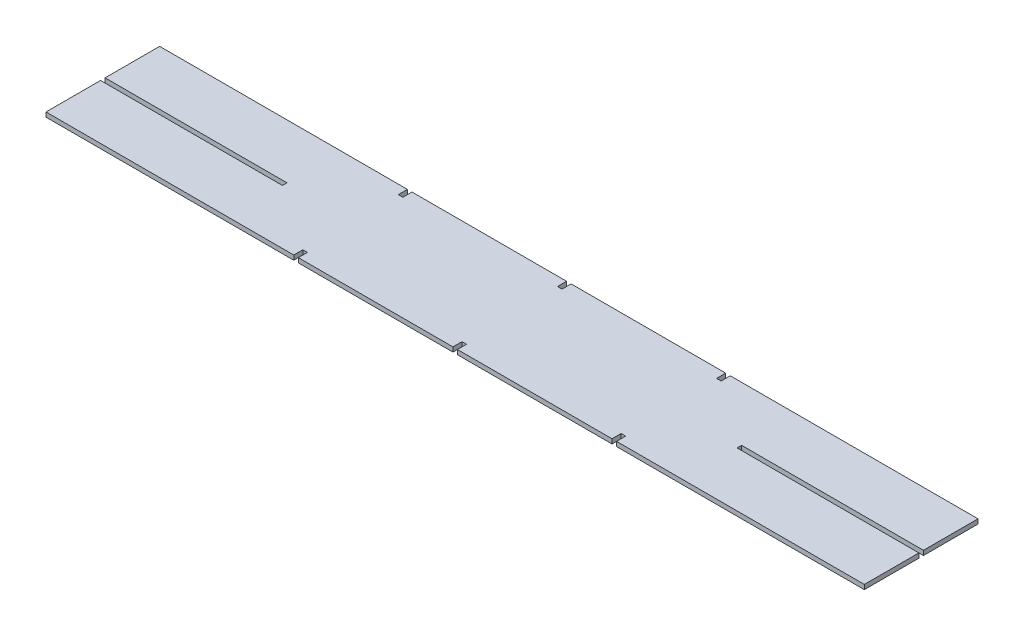
ISO-10303-21;
HEADER;
FILE_DESCRIPTION(('STEP AP214'),'2;1');
FILE_NAME('part.step','',(''),(''),'','','');
FILE_SCHEMA(('AUTOMOTIVE_DESIGN { 1 0 10303 214 1 1 1 1 }'));
ENDSEC;
DATA;
#1=APPLICATION_CONTEXT('core data for automotive mechanical design processes');
#2=APPLICATION_PROTOCOL_DEFINITION('international standard','automotive_design',2000,#1);
#3=PRODUCT_CONTEXT('',#1,'mechanical');
#4=PRODUCT('Part','Part','',(#3));
#5=PRODUCT_RELATED_PRODUCT_CATEGORY('part','',(#4));
#6=PRODUCT_DEFINITION_FORMATION('','',#4);
#7=PRODUCT_DEFINITION_CONTEXT('part definition',#1,'design');
#8=PRODUCT_DEFINITION('design','',#6,#7);
#9=PRODUCT_DEFINITION_SHAPE('','',#8);
#10=(LENGTH_UNIT() NAMED_UNIT(*) SI_UNIT(.MILLI.,.METRE.));
#11=(NAMED_UNIT(*) PLANE_ANGLE_UNIT() SI_UNIT($,.RADIAN.));
#12=(NAMED_UNIT(*) SI_UNIT($,.STERADIAN.) SOLID_ANGLE_UNIT());
#13=UNCERTAINTY_MEASURE_WITH_UNIT(LENGTH_MEASURE(1.E-05),#10,'distance_accuracy_value','');
#14=(GEOMETRIC_REPRESENTATION_CONTEXT(3) GLOBAL_UNCERTAINTY_ASSIGNED_CONTEXT((#13)) GLOBAL_UNIT_ASSIGNED_CONTEXT((#10,
#11,#12)) REPRESENTATION_CONTEXT('',''));
#15=CARTESIAN_POINT('',(0.,0.,0.));
#16=DIRECTION('',(0.,0.,1.));
#17=DIRECTION('',(1.,0.,0.));
#18=AXIS2_PLACEMENT_3D('',#15,#16,#17);
#19=CARTESIAN_POINT('',(90.,1.,12.5));
#20=DIRECTION('',(0.,0.,-1.));
#21=DIRECTION('',(-1.,0.,0.));
#22=AXIS2_PLACEMENT_3D('',#19,#20,#21);
#23=PLANE('',#22);
#24=DIRECTION('',(1.,0.,0.));
#25=VECTOR('',#24,1.);
#26=CARTESIAN_POINT('',(90.,0.,12.5));
#27=LINE('',#26,#25);
#28=CARTESIAN_POINT('',(35.5,0.,12.5));
#29=VERTEX_POINT('',#28);
#30=CARTESIAN_POINT('',(90.,0.,12.5));
#31=VERTEX_POINT('',#30);
#32=EDGE_CURVE('E297',#29,#31,#27,.T.);
#33=ORIENTED_EDGE('',*,*,#32,.T.);
#34=DIRECTION('',(0.,-1.,0.));
#35=VECTOR('',#34,1.);
#36=CARTESIAN_POINT('',(90.,1.,12.5));
#37=LINE('',#36,#35);
#38=CARTESIAN_POINT('',(90.,1.,12.5));
#39=VERTEX_POINT('',#38);
#40=EDGE_CURVE('E11',#39,#31,#37,.T.);
#41=ORIENTED_EDGE('',*,*,#40,.F.);
#42=DIRECTION('',(1.,0.,0.));
#43=VECTOR('',#42,1.);
#44=CARTESIAN_POINT('',(90.,1.,12.5));
#45=LINE('',#44,#43);
#46=CARTESIAN_POINT('',(35.5,1.,12.5));
#47=VERTEX_POINT('',#46);
#48=EDGE_CURVE('E367',#47,#39,#45,.T.);
#49=ORIENTED_EDGE('',*,*,#48,.F.);
#50=DIRECTION('',(0.,-1.,0.));
#51=VECTOR('',#50,1.);
#52=CARTESIAN_POINT('',(35.5,1.,12.5));
#53=LINE('',#52,#51);
#54=EDGE_CURVE('E293',#47,#29,#53,.T.);
#55=ORIENTED_EDGE('',*,*,#54,.T.);
#56=EDGE_LOOP('',(#33,#41,#49,#55));
#57=FACE_BOUND('',#56,.T.);
#58=ADVANCED_FACE('F33',(#57),#23,.F.);
#59=CARTESIAN_POINT('',(90.,1.,0.5));
#60=DIRECTION('',(-1.,0.,0.));
#61=DIRECTION('',(0.,0.,1.));
#62=AXIS2_PLACEMENT_3D('',#59,#60,#61);
#63=PLANE('',#62);
#64=DIRECTION('',(0.,0.,-1.));
#65=VECTOR('',#64,1.);
#66=CARTESIAN_POINT('',(90.,0.,0.5));
#67=LINE('',#66,#65);
#68=CARTESIAN_POINT('',(90.,0.,0.5));
#69=VERTEX_POINT('',#68);
#70=EDGE_CURVE('E300',#31,#69,#67,.T.);
#71=ORIENTED_EDGE('',*,*,#70,.T.);
#72=DIRECTION('',(0.,-1.,0.));
#73=VECTOR('',#72,1.);
#74=CARTESIAN_POINT('',(90.,1.,0.5));
#75=LINE('',#74,#73);
#76=CARTESIAN_POINT('',(90.,1.,0.5));
#77=VERTEX_POINT('',#76);
#78=EDGE_CURVE('E41',#77,#69,#75,.T.);
#79=ORIENTED_EDGE('',*,*,#78,.F.);
#80=DIRECTION('',(0.,0.,-1.));
#81=VECTOR('',#80,1.);
#82=CARTESIAN_POINT('',(90.,1.,0.5));
#83=LINE('',#82,#81);
#84=EDGE_CURVE('E176',#39,#77,#83,.T.);
#85=ORIENTED_EDGE('',*,*,#84,.F.);
#86=ORIENTED_EDGE('',*,*,#40,.T.);
#87=EDGE_LOOP('',(#71,#79,#85,#86));
#88=FACE_BOUND('',#87,.T.);
#89=ADVANCED_FACE('F565',(#88),#63,.F.);
#90=CARTESIAN_POINT('',(50.,1.,0.499999999999995));
#91=DIRECTION('',(0.,0.,1.));
#92=DIRECTION('',(1.,0.,0.));
#93=AXIS2_PLACEMENT_3D('',#90,#91,#92);
#94=PLANE('',#93);
#95=DIRECTION('',(-1.,0.,0.));
#96=VECTOR('',#95,1.);
#97=CARTESIAN_POINT('',(50.,0.,0.499999999999995));
#98=LINE('',#97,#96);
#99=CARTESIAN_POINT('',(50.,0.,0.499999999999995));
#100=VERTEX_POINT('',#99);
#101=EDGE_CURVE('E302',#69,#100,#98,.T.);
#102=ORIENTED_EDGE('',*,*,#101,.T.);
#103=DIRECTION('',(0.,-1.,0.));
#104=VECTOR('',#103,1.);
#105=CARTESIAN_POINT('',(50.,1.,0.499999999999995));
#106=LINE('',#105,#104);
#107=CARTESIAN_POINT('',(50.,1.,0.499999999999995));
#108=VERTEX_POINT('',#107);
#109=EDGE_CURVE('E458',#108,#100,#106,.T.);
#110=ORIENTED_EDGE('',*,*,#109,.F.);
#111=DIRECTION('',(-1.,0.,0.));
#112=VECTOR('',#111,1.);
#113=CARTESIAN_POINT('',(50.,1.,0.499999999999995));
#114=LINE('',#113,#112);
#115=EDGE_CURVE('E466',#77,#108,#114,.T.);
#116=ORIENTED_EDGE('',*,*,#115,.F.);
#117=ORIENTED_EDGE('',*,*,#78,.T.);
#118=EDGE_LOOP('',(#102,#110,#116,#117));
#119=FACE_BOUND('',#118,.T.);
#120=ADVANCED_FACE('F464',(#119),#94,.F.);
#121=CARTESIAN_POINT('',(50.,1.,-0.499999999999995));
#122=DIRECTION('',(-1.,0.,0.));
#123=DIRECTION('',(0.,0.,1.));
#124=AXIS2_PLACEMENT_3D('',#121,#122,#123);
#125=PLANE('',#124);
#126=DIRECTION('',(0.,0.,-1.));
#127=VECTOR('',#126,1.);
#128=CARTESIAN_POINT('',(50.,0.,-0.499999999999995));
#129=LINE('',#128,#127);
#130=CARTESIAN_POINT('',(50.,0.,-0.499999999999995));
#131=VERTEX_POINT('',#130);
#132=EDGE_CURVE('E304',#100,#131,#129,.T.);
#133=ORIENTED_EDGE('',*,*,#132,.T.);
#134=DIRECTION('',(0.,-1.,0.));
#135=VECTOR('',#134,1.);
#136=CARTESIAN_POINT('',(50.,1.,-0.499999999999995));
#137=LINE('',#136,#135);
#138=CARTESIAN_POINT('',(50.,1.,-0.499999999999995));
#139=VERTEX_POINT('',#138);
#140=EDGE_CURVE('E455',#139,#131,#137,.T.);
#141=ORIENTED_EDGE('',*,*,#140,.F.);
#142=DIRECTION('',(0.,0.,-1.));
#143=VECTOR('',#142,1.);
#144=CARTESIAN_POINT('',(50.,1.,-0.499999999999995));
#145=LINE('',#144,#143);
#146=EDGE_CURVE('E484',#108,#139,#145,.T.);
#147=ORIENTED_EDGE('',*,*,#146,.F.);
#148=ORIENTED_EDGE('',*,*,#109,.T.);
#149=EDGE_LOOP('',(#133,#141,#147,#148));
#150=FACE_BOUND('',#149,.T.);
#151=ADVANCED_FACE('F475',(#150),#125,.F.);
#152=CARTESIAN_POINT('',(90.,1.,-0.5));
#153=DIRECTION('',(0.,0.,-1.));
#154=DIRECTION('',(-1.,0.,0.));
#155=AXIS2_PLACEMENT_3D('',#152,#153,#154);
#156=PLANE('',#155);
#157=DIRECTION('',(1.,0.,0.));
#158=VECTOR('',#157,1.);
#159=CARTESIAN_POINT('',(90.,0.,-0.5));
#160=LINE('',#159,#158);
#161=CARTESIAN_POINT('',(90.,0.,-0.5));
#162=VERTEX_POINT('',#161);
#163=EDGE_CURVE('E306',#131,#162,#160,.T.);
#164=ORIENTED_EDGE('',*,*,#163,.T.);
#165=DIRECTION('',(0.,-1.,0.));
#166=VECTOR('',#165,1.);
#167=CARTESIAN_POINT('',(90.,1.,-0.5));
#168=LINE('',#167,#166);
#169=CARTESIAN_POINT('',(90.,1.,-0.5));
#170=VERTEX_POINT('',#169);
#171=EDGE_CURVE('E452',#170,#162,#168,.T.);
#172=ORIENTED_EDGE('',*,*,#171,.F.);
#173=DIRECTION('',(1.,0.,0.));
#174=VECTOR('',#173,1.);
#175=CARTESIAN_POINT('',(90.,1.,-0.5));
#176=LINE('',#175,#174);
#177=EDGE_CURVE('E481',#139,#170,#176,.T.);
#178=ORIENTED_EDGE('',*,*,#177,.F.);
#179=ORIENTED_EDGE('',*,*,#140,.T.);
#180=EDGE_LOOP('',(#164,#172,#178,#179));
#181=FACE_BOUND('',#180,.T.);
#182=ADVANCED_FACE('F479',(#181),#156,.F.);
#183=CARTESIAN_POINT('',(90.,1.,-12.5));
#184=DIRECTION('',(-1.,0.,0.));
#185=DIRECTION('',(0.,0.,1.));
#186=AXIS2_PLACEMENT_3D('',#183,#184,#185);
#187=PLANE('',#186);
#188=DIRECTION('',(0.,0.,-1.));
#189=VECTOR('',#188,1.);
#190=CARTESIAN_POINT('',(90.,0.,-12.5));
#191=LINE('',#190,#189);
#192=CARTESIAN_POINT('',(90.,0.,-12.5));
#193=VERTEX_POINT('',#192);
#194=EDGE_CURVE('E308',#162,#193,#191,.T.);
#195=ORIENTED_EDGE('',*,*,#194,.T.);
#196=DIRECTION('',(0.,-1.,0.));
#197=VECTOR('',#196,1.);
#198=CARTESIAN_POINT('',(90.,1.,-12.5));
#199=LINE('',#198,#197);
#200=CARTESIAN_POINT('',(90.,1.,-12.5));
#201=VERTEX_POINT('',#200);
#202=EDGE_CURVE('E449',#201,#193,#199,.T.);
#203=ORIENTED_EDGE('',*,*,#202,.F.);
#204=DIRECTION('',(0.,0.,-1.));
#205=VECTOR('',#204,1.);
#206=CARTESIAN_POINT('',(90.,1.,-12.5));
#207=LINE('',#206,#205);
#208=EDGE_CURVE('E483',#170,#201,#207,.T.);
#209=ORIENTED_EDGE('',*,*,#208,.F.);
#210=ORIENTED_EDGE('',*,*,#171,.T.);
#211=EDGE_LOOP('',(#195,#203,#209,#210));
#212=FACE_BOUND('',#211,.T.);
#213=ADVANCED_FACE('F578',(#212),#187,.F.);
#214=CARTESIAN_POINT('',(35.5,1.,-12.5));
#215=DIRECTION('',(0.,0.,1.));
#216=DIRECTION('',(1.,0.,0.));
#217=AXIS2_PLACEMENT_3D('',#214,#215,#216);
#218=PLANE('',#217);
#219=DIRECTION('',(-1.,0.,0.));
#220=VECTOR('',#219,1.);
#221=CARTESIAN_POINT('',(35.5,0.,-12.5));
#222=LINE('',#221,#220);
#223=CARTESIAN_POINT('',(35.5,0.,-12.5));
#224=VERTEX_POINT('',#223);
#225=EDGE_CURVE('E310',#193,#224,#222,.T.);
#226=ORIENTED_EDGE('',*,*,#225,.T.);
#227=DIRECTION('',(0.,-1.,0.));
#228=VECTOR('',#227,1.);
#229=CARTESIAN_POINT('',(35.5,1.,-12.5));
#230=LINE('',#229,#228);
#231=CARTESIAN_POINT('',(35.5,1.,-12.5));
#232=VERTEX_POINT('',#231);
#233=EDGE_CURVE('E446',#232,#224,#230,.T.);
#234=ORIENTED_EDGE('',*,*,#233,.F.);
#235=DIRECTION('',(-1.,0.,0.));
#236=VECTOR('',#235,1.);
#237=CARTESIAN_POINT('',(35.5,1.,-12.5));
#238=LINE('',#237,#236);
#239=EDGE_CURVE('E486',#201,#232,#238,.T.);
#240=ORIENTED_EDGE('',*,*,#239,.F.);
#241=ORIENTED_EDGE('',*,*,#202,.T.);
#242=EDGE_LOOP('',(#226,#234,#240,#241));
#243=FACE_BOUND('',#242,.T.);
#244=ADVANCED_FACE('F581',(#243),#218,.F.);
#245=CARTESIAN_POINT('',(35.5,1.,-10.5));
#246=DIRECTION('',(1.,0.,0.));
#247=DIRECTION('',(0.,0.,-1.));
#248=AXIS2_PLACEMENT_3D('',#245,#246,#247);
#249=PLANE('',#248);
#250=DIRECTION('',(0.,0.,1.));
#251=VECTOR('',#250,1.);
#252=CARTESIAN_POINT('',(35.5,0.,-10.5));
#253=LINE('',#252,#251);
#254=CARTESIAN_POINT('',(35.5,0.,-10.5));
#255=VERTEX_POINT('',#254);
#256=EDGE_CURVE('E312',#224,#255,#253,.T.);
#257=ORIENTED_EDGE('',*,*,#256,.T.);
#258=DIRECTION('',(0.,-1.,0.));
#259=VECTOR('',#258,1.);
#260=CARTESIAN_POINT('',(35.5,1.,-10.5));
#261=LINE('',#260,#259);
#262=CARTESIAN_POINT('',(35.5,1.,-10.5));
#263=VERTEX_POINT('',#262);
#264=EDGE_CURVE('E443',#263,#255,#261,.T.);
#265=ORIENTED_EDGE('',*,*,#264,.F.);
#266=DIRECTION('',(0.,0.,1.));
#267=VECTOR('',#266,1.);
#268=CARTESIAN_POINT('',(35.5,1.,-10.5));
#269=LINE('',#268,#267);
#270=EDGE_CURVE('E492',#232,#263,#269,.T.);
#271=ORIENTED_EDGE('',*,*,#270,.F.);
#272=ORIENTED_EDGE('',*,*,#233,.T.);
#273=EDGE_LOOP('',(#257,#265,#271,#272));
#274=FACE_BOUND('',#273,.T.);
#275=ADVANCED_FACE('F585',(#274),#249,.F.);
#276=CARTESIAN_POINT('',(34.5,1.,-10.5));
#277=DIRECTION('',(0.,0.,1.));
#278=DIRECTION('',(1.,0.,0.));
#279=AXIS2_PLACEMENT_3D('',#276,#277,#278);
#280=PLANE('',#279);
#281=DIRECTION('',(-1.,0.,0.));
#282=VECTOR('',#281,1.);
#283=CARTESIAN_POINT('',(34.5,0.,-10.5));
#284=LINE('',#283,#282);
#285=CARTESIAN_POINT('',(34.5,0.,-10.5));
#286=VERTEX_POINT('',#285);
#287=EDGE_CURVE('E314',#255,#286,#284,.T.);
#288=ORIENTED_EDGE('',*,*,#287,.T.);
#289=DIRECTION('',(0.,-1.,0.));
#290=VECTOR('',#289,1.);
#291=CARTESIAN_POINT('',(34.5,1.,-10.5));
#292=LINE('',#291,#290);
#293=CARTESIAN_POINT('',(34.5,1.,-10.5));
#294=VERTEX_POINT('',#293);
#295=EDGE_CURVE('E440',#294,#286,#292,.T.);
#296=ORIENTED_EDGE('',*,*,#295,.F.);
#297=DIRECTION('',(-1.,0.,0.));
#298=VECTOR('',#297,1.);
#299=CARTESIAN_POINT('',(34.5,1.,-10.5));
#300=LINE('',#299,#298);
#301=EDGE_CURVE('E494',#263,#294,#300,.T.);
#302=ORIENTED_EDGE('',*,*,#301,.F.);
#303=ORIENTED_EDGE('',*,*,#264,.T.);
#304=EDGE_LOOP('',(#288,#296,#302,#303));
#305=FACE_BOUND('',#304,.T.);
#306=ADVANCED_FACE('F589',(#305),#280,.F.);
#307=CARTESIAN_POINT('',(34.5,1.,-12.5));
#308=DIRECTION('',(-1.,0.,0.));
#309=DIRECTION('',(0.,0.,1.));
#310=AXIS2_PLACEMENT_3D('',#307,#308,#309);
#311=PLANE('',#310);
#312=DIRECTION('',(0.,0.,-1.));
#313=VECTOR('',#312,1.);
#314=CARTESIAN_POINT('',(34.5,0.,-12.5));
#315=LINE('',#314,#313);
#316=CARTESIAN_POINT('',(34.5,0.,-12.5));
#317=VERTEX_POINT('',#316);
#318=EDGE_CURVE('E316',#286,#317,#315,.T.);
#319=ORIENTED_EDGE('',*,*,#318,.T.);
#320=DIRECTION('',(0.,-1.,0.));
#321=VECTOR('',#320,1.);
#322=CARTESIAN_POINT('',(34.5,1.,-12.5));
#323=LINE('',#322,#321);
#324=CARTESIAN_POINT('',(34.5,1.,-12.5));
#325=VERTEX_POINT('',#324);
#326=EDGE_CURVE('E437',#325,#317,#323,.T.);
#327=ORIENTED_EDGE('',*,*,#326,.F.);
#328=DIRECTION('',(0.,0.,-1.));
#329=VECTOR('',#328,1.);
#330=CARTESIAN_POINT('',(34.5,1.,-12.5));
#331=LINE('',#330,#329);
#332=EDGE_CURVE('E496',#294,#325,#331,.T.);
#333=ORIENTED_EDGE('',*,*,#332,.F.);
#334=ORIENTED_EDGE('',*,*,#295,.T.);
#335=EDGE_LOOP('',(#319,#327,#333,#334));
#336=FACE_BOUND('',#335,.T.);
#337=ADVANCED_FACE('F593',(#336),#311,.F.);
#338=CARTESIAN_POINT('',(0.5,1.,-12.5));
#339=DIRECTION('',(0.,0.,1.));
#340=DIRECTION('',(1.,0.,0.));
#341=AXIS2_PLACEMENT_3D('',#338,#339,#340);
#342=PLANE('',#341);
#343=DIRECTION('',(-1.,0.,0.));
#344=VECTOR('',#343,1.);
#345=CARTESIAN_POINT('',(0.5,0.,-12.5));
#346=LINE('',#345,#344);
#347=CARTESIAN_POINT('',(0.5,0.,-12.5));
#348=VERTEX_POINT('',#347);
#349=EDGE_CURVE('E318',#317,#348,#346,.T.);
#350=ORIENTED_EDGE('',*,*,#349,.T.);
#351=DIRECTION('',(0.,-1.,0.));
#352=VECTOR('',#351,1.);
#353=CARTESIAN_POINT('',(0.5,1.,-12.5));
#354=LINE('',#353,#352);
#355=CARTESIAN_POINT('',(0.5,1.,-12.5));
#356=VERTEX_POINT('',#355);
#357=EDGE_CURVE('E434',#356,#348,#354,.T.);
#358=ORIENTED_EDGE('',*,*,#357,.F.);
#359=DIRECTION('',(-1.,0.,0.));
#360=VECTOR('',#359,1.);
#361=CARTESIAN_POINT('',(0.5,1.,-12.5));
#362=LINE('',#361,#360);
#363=EDGE_CURVE('E498',#325,#356,#362,.T.);
#364=ORIENTED_EDGE('',*,*,#363,.F.);
#365=ORIENTED_EDGE('',*,*,#326,.T.);
#366=EDGE_LOOP('',(#350,#358,#364,#365));
#367=FACE_BOUND('',#366,.T.);
#368=ADVANCED_FACE('F597',(#367),#342,.F.);
#369=CARTESIAN_POINT('',(0.5,1.,-10.5));
#370=DIRECTION('',(1.,0.,0.));
#371=DIRECTION('',(0.,0.,-1.));
#372=AXIS2_PLACEMENT_3D('',#369,#370,#371);
#373=PLANE('',#372);
#374=DIRECTION('',(0.,0.,1.));
#375=VECTOR('',#374,1.);
#376=CARTESIAN_POINT('',(0.5,0.,-10.5));
#377=LINE('',#376,#375);
#378=CARTESIAN_POINT('',(0.5,0.,-10.5));
#379=VERTEX_POINT('',#378);
#380=EDGE_CURVE('E320',#348,#379,#377,.T.);
#381=ORIENTED_EDGE('',*,*,#380,.T.);
#382=DIRECTION('',(0.,-1.,0.));
#383=VECTOR('',#382,1.);
#384=CARTESIAN_POINT('',(0.5,1.,-10.5));
#385=LINE('',#384,#383);
#386=CARTESIAN_POINT('',(0.5,1.,-10.5));
#387=VERTEX_POINT('',#386);
#388=EDGE_CURVE('E431',#387,#379,#385,.T.);
#389=ORIENTED_EDGE('',*,*,#388,.F.);
#390=DIRECTION('',(0.,0.,1.));
#391=VECTOR('',#390,1.);
#392=CARTESIAN_POINT('',(0.5,1.,-10.5));
#393=LINE('',#392,#391);
#394=EDGE_CURVE('E500',#356,#387,#393,.T.);
#395=ORIENTED_EDGE('',*,*,#394,.F.);
#396=ORIENTED_EDGE('',*,*,#357,.T.);
#397=EDGE_LOOP('',(#381,#389,#395,#396));
#398=FACE_BOUND('',#397,.T.);
#399=ADVANCED_FACE('F601',(#398),#373,.F.);
#400=CARTESIAN_POINT('',(-0.5,1.,-10.5));
#401=DIRECTION('',(0.,0.,1.));
#402=DIRECTION('',(1.,0.,0.));
#403=AXIS2_PLACEMENT_3D('',#400,#401,#402);
#404=PLANE('',#403);
#405=DIRECTION('',(-1.,0.,0.));
#406=VECTOR('',#405,1.);
#407=CARTESIAN_POINT('',(-0.5,0.,-10.5));
#408=LINE('',#407,#406);
#409=CARTESIAN_POINT('',(-0.5,0.,-10.5));
#410=VERTEX_POINT('',#409);
#411=EDGE_CURVE('E322',#379,#410,#408,.T.);
#412=ORIENTED_EDGE('',*,*,#411,.T.);
#413=DIRECTION('',(0.,-1.,0.));
#414=VECTOR('',#413,1.);
#415=CARTESIAN_POINT('',(-0.5,1.,-10.5));
#416=LINE('',#415,#414);
#417=CARTESIAN_POINT('',(-0.5,1.,-10.5));
#418=VERTEX_POINT('',#417);
#419=EDGE_CURVE('E428',#418,#410,#416,.T.);
#420=ORIENTED_EDGE('',*,*,#419,.F.);
#421=DIRECTION('',(-1.,0.,0.));
#422=VECTOR('',#421,1.);
#423=CARTESIAN_POINT('',(-0.5,1.,-10.5));
#424=LINE('',#423,#422);
#425=EDGE_CURVE('E502',#387,#418,#424,.T.);
#426=ORIENTED_EDGE('',*,*,#425,.F.);
#427=ORIENTED_EDGE('',*,*,#388,.T.);
#428=EDGE_LOOP('',(#412,#420,#426,#427));
#429=FACE_BOUND('',#428,.T.);
#430=ADVANCED_FACE('F605',(#429),#404,.F.);
#431=CARTESIAN_POINT('',(-0.5,1.,-12.5));
#432=DIRECTION('',(-1.,0.,0.));
#433=DIRECTION('',(0.,0.,1.));
#434=AXIS2_PLACEMENT_3D('',#431,#432,#433);
#435=PLANE('',#434);
#436=DIRECTION('',(0.,0.,-1.));
#437=VECTOR('',#436,1.);
#438=CARTESIAN_POINT('',(-0.5,0.,-12.5));
#439=LINE('',#438,#437);
#440=CARTESIAN_POINT('',(-0.5,0.,-12.5));
#441=VERTEX_POINT('',#440);
#442=EDGE_CURVE('E324',#410,#441,#439,.T.);
#443=ORIENTED_EDGE('',*,*,#442,.T.);
#444=DIRECTION('',(0.,-1.,0.));
#445=VECTOR('',#444,1.);
#446=CARTESIAN_POINT('',(-0.5,1.,-12.5));
#447=LINE('',#446,#445);
#448=CARTESIAN_POINT('',(-0.5,1.,-12.5));
#449=VERTEX_POINT('',#448);
#450=EDGE_CURVE('E425',#449,#441,#447,.T.);
#451=ORIENTED_EDGE('',*,*,#450,.F.);
#452=DIRECTION('',(0.,0.,-1.));
#453=VECTOR('',#452,1.);
#454=CARTESIAN_POINT('',(-0.5,1.,-12.5));
#455=LINE('',#454,#453);
#456=EDGE_CURVE('E504',#418,#449,#455,.T.);
#457=ORIENTED_EDGE('',*,*,#456,.F.);
#458=ORIENTED_EDGE('',*,*,#419,.T.);
#459=EDGE_LOOP('',(#443,#451,#457,#458));
#460=FACE_BOUND('',#459,.T.);
#461=ADVANCED_FACE('F609',(#460),#435,.F.);
#462=CARTESIAN_POINT('',(-34.5,1.,-12.5));
#463=DIRECTION('',(0.,0.,1.));
#464=DIRECTION('',(1.,0.,0.));
#465=AXIS2_PLACEMENT_3D('',#462,#463,#464);
#466=PLANE('',#465);
#467=DIRECTION('',(-1.,0.,0.));
#468=VECTOR('',#467,1.);
#469=CARTESIAN_POINT('',(-34.5,0.,-12.5));
#470=LINE('',#469,#468);
#471=CARTESIAN_POINT('',(-34.5,0.,-12.5));
#472=VERTEX_POINT('',#471);
#473=EDGE_CURVE('E326',#441,#472,#470,.T.);
#474=ORIENTED_EDGE('',*,*,#473,.T.);
#475=DIRECTION('',(0.,-1.,0.));
#476=VECTOR('',#475,1.);
#477=CARTESIAN_POINT('',(-34.5,1.,-12.5));
#478=LINE('',#477,#476);
#479=CARTESIAN_POINT('',(-34.5,1.,-12.5));
#480=VERTEX_POINT('',#479);
#481=EDGE_CURVE('E422',#480,#472,#478,.T.);
#482=ORIENTED_EDGE('',*,*,#481,.F.);
#483=DIRECTION('',(-1.,0.,0.));
#484=VECTOR('',#483,1.);
#485=CARTESIAN_POINT('',(-34.5,1.,-12.5));
#486=LINE('',#485,#484);
#487=EDGE_CURVE('E506',#449,#480,#486,.T.);
#488=ORIENTED_EDGE('',*,*,#487,.F.);
#489=ORIENTED_EDGE('',*,*,#450,.T.);
#490=EDGE_LOOP('',(#474,#482,#488,#489));
#491=FACE_BOUND('',#490,.T.);
#492=ADVANCED_FACE('F613',(#491),#466,.F.);
#493=CARTESIAN_POINT('',(-34.5,1.,-10.5));
#494=DIRECTION('',(1.,0.,0.));
#495=DIRECTION('',(0.,0.,-1.));
#496=AXIS2_PLACEMENT_3D('',#493,#494,#495);
#497=PLANE('',#496);
#498=DIRECTION('',(0.,0.,1.));
#499=VECTOR('',#498,1.);
#500=CARTESIAN_POINT('',(-34.5,0.,-10.5));
#501=LINE('',#500,#499);
#502=CARTESIAN_POINT('',(-34.5,0.,-10.5));
#503=VERTEX_POINT('',#502);
#504=EDGE_CURVE('E328',#472,#503,#501,.T.);
#505=ORIENTED_EDGE('',*,*,#504,.T.);
#506=DIRECTION('',(0.,-1.,0.));
#507=VECTOR('',#506,1.);
#508=CARTESIAN_POINT('',(-34.5,1.,-10.5));
#509=LINE('',#508,#507);
#510=CARTESIAN_POINT('',(-34.5,1.,-10.5));
#511=VERTEX_POINT('',#510);
#512=EDGE_CURVE('E419',#511,#503,#509,.T.);
#513=ORIENTED_EDGE('',*,*,#512,.F.);
#514=DIRECTION('',(0.,0.,1.));
#515=VECTOR('',#514,1.);
#516=CARTESIAN_POINT('',(-34.5,1.,-10.5));
#517=LINE('',#516,#515);
#518=EDGE_CURVE('E508',#480,#511,#517,.T.);
#519=ORIENTED_EDGE('',*,*,#518,.F.);
#520=ORIENTED_EDGE('',*,*,#481,.T.);
#521=EDGE_LOOP('',(#505,#513,#519,#520));
#522=FACE_BOUND('',#521,.T.);
#523=ADVANCED_FACE('F617',(#522),#497,.F.);
#524=CARTESIAN_POINT('',(-35.5,1.,-10.5));
#525=DIRECTION('',(0.,0.,1.));
#526=DIRECTION('',(1.,0.,0.));
#527=AXIS2_PLACEMENT_3D('',#524,#525,#526);
#528=PLANE('',#527);
#529=DIRECTION('',(-1.,0.,0.));
#530=VECTOR('',#529,1.);
#531=CARTESIAN_POINT('',(-35.5,0.,-10.5));
#532=LINE('',#531,#530);
#533=CARTESIAN_POINT('',(-35.5,0.,-10.5));
#534=VERTEX_POINT('',#533);
#535=EDGE_CURVE('E330',#503,#534,#532,.T.);
#536=ORIENTED_EDGE('',*,*,#535,.T.);
#537=DIRECTION('',(0.,-1.,0.));
#538=VECTOR('',#537,1.);
#539=CARTESIAN_POINT('',(-35.5,1.,-10.5));
#540=LINE('',#539,#538);
#541=CARTESIAN_POINT('',(-35.5,1.,-10.5));
#542=VERTEX_POINT('',#541);
#543=EDGE_CURVE('E416',#542,#534,#540,.T.);
#544=ORIENTED_EDGE('',*,*,#543,.F.);
#545=DIRECTION('',(-1.,0.,0.));
#546=VECTOR('',#545,1.);
#547=CARTESIAN_POINT('',(-35.5,1.,-10.5));
#548=LINE('',#547,#546);
#549=EDGE_CURVE('E510',#511,#542,#548,.T.);
#550=ORIENTED_EDGE('',*,*,#549,.F.);
#551=ORIENTED_EDGE('',*,*,#512,.T.);
#552=EDGE_LOOP('',(#536,#544,#550,#551));
#553=FACE_BOUND('',#552,.T.);
#554=ADVANCED_FACE('F621',(#553),#528,.F.);
#555=CARTESIAN_POINT('',(-35.5,1.,-12.5));
#556=DIRECTION('',(-1.,0.,0.));
#557=DIRECTION('',(0.,0.,1.));
#558=AXIS2_PLACEMENT_3D('',#555,#556,#557);
#559=PLANE('',#558);
#560=DIRECTION('',(0.,0.,-1.));
#561=VECTOR('',#560,1.);
#562=CARTESIAN_POINT('',(-35.5,0.,-12.5));
#563=LINE('',#562,#561);
#564=CARTESIAN_POINT('',(-35.5,0.,-12.5));
#565=VERTEX_POINT('',#564);
#566=EDGE_CURVE('E332',#534,#565,#563,.T.);
#567=ORIENTED_EDGE('',*,*,#566,.T.);
#568=DIRECTION('',(0.,-1.,0.));
#569=VECTOR('',#568,1.);
#570=CARTESIAN_POINT('',(-35.5,1.,-12.5));
#571=LINE('',#570,#569);
#572=CARTESIAN_POINT('',(-35.5,1.,-12.5));
#573=VERTEX_POINT('',#572);
#574=EDGE_CURVE('E413',#573,#565,#571,.T.);
#575=ORIENTED_EDGE('',*,*,#574,.F.);
#576=DIRECTION('',(0.,0.,-1.));
#577=VECTOR('',#576,1.);
#578=CARTESIAN_POINT('',(-35.5,1.,-12.5));
#579=LINE('',#578,#577);
#580=EDGE_CURVE('E512',#542,#573,#579,.T.);
#581=ORIENTED_EDGE('',*,*,#580,.F.);
#582=ORIENTED_EDGE('',*,*,#543,.T.);
#583=EDGE_LOOP('',(#567,#575,#581,#582));
#584=FACE_BOUND('',#583,.T.);
#585=ADVANCED_FACE('F625',(#584),#559,.F.);
#586=CARTESIAN_POINT('',(-90.,1.,-12.5));
#587=DIRECTION('',(0.,0.,1.));
#588=DIRECTION('',(1.,0.,0.));
#589=AXIS2_PLACEMENT_3D('',#586,#587,#588);
#590=PLANE('',#589);
#591=DIRECTION('',(-1.,0.,0.));
#592=VECTOR('',#591,1.);
#593=CARTESIAN_POINT('',(-90.,0.,-12.5));
#594=LINE('',#593,#592);
#595=CARTESIAN_POINT('',(-90.,0.,-12.5));
#596=VERTEX_POINT('',#595);
#597=EDGE_CURVE('E334',#565,#596,#594,.T.);
#598=ORIENTED_EDGE('',*,*,#597,.T.);
#599=DIRECTION('',(0.,-1.,0.));
#600=VECTOR('',#599,1.);
#601=CARTESIAN_POINT('',(-90.,1.,-12.5));
#602=LINE('',#601,#600);
#603=CARTESIAN_POINT('',(-90.,1.,-12.5));
#604=VERTEX_POINT('',#603);
#605=EDGE_CURVE('E410',#604,#596,#602,.T.);
#606=ORIENTED_EDGE('',*,*,#605,.F.);
#607=DIRECTION('',(-1.,0.,0.));
#608=VECTOR('',#607,1.);
#609=CARTESIAN_POINT('',(-90.,1.,-12.5));
#610=LINE('',#609,#608);
#611=EDGE_CURVE('E514',#573,#604,#610,.T.);
#612=ORIENTED_EDGE('',*,*,#611,.F.);
#613=ORIENTED_EDGE('',*,*,#574,.T.);
#614=EDGE_LOOP('',(#598,#606,#612,#613));
#615=FACE_BOUND('',#614,.T.);
#616=ADVANCED_FACE('F629',(#615),#590,.F.);
#617=CARTESIAN_POINT('',(-90.,1.,-0.499999999999995));
#618=DIRECTION('',(1.,0.,0.));
#619=DIRECTION('',(0.,0.,-1.));
#620=AXIS2_PLACEMENT_3D('',#617,#618,#619);
#621=PLANE('',#620);
#622=DIRECTION('',(0.,0.,1.));
#623=VECTOR('',#622,1.);
#624=CARTESIAN_POINT('',(-90.,0.,-0.499999999999995));
#625=LINE('',#624,#623);
#626=CARTESIAN_POINT('',(-90.,0.,-0.499999999999995));
#627=VERTEX_POINT('',#626);
#628=EDGE_CURVE('E336',#596,#627,#625,.T.);
#629=ORIENTED_EDGE('',*,*,#628,.T.);
#630=DIRECTION('',(0.,-1.,0.));
#631=VECTOR('',#630,1.);
#632=CARTESIAN_POINT('',(-90.,1.,-0.499999999999995));
#633=LINE('',#632,#631);
#634=CARTESIAN_POINT('',(-90.,1.,-0.499999999999995));
#635=VERTEX_POINT('',#634);
#636=EDGE_CURVE('E407',#635,#627,#633,.T.);
#637=ORIENTED_EDGE('',*,*,#636,.F.);
#638=DIRECTION('',(0.,0.,1.));
#639=VECTOR('',#638,1.);
#640=CARTESIAN_POINT('',(-90.,1.,-0.499999999999995));
#641=LINE('',#640,#639);
#642=EDGE_CURVE('E516',#604,#635,#641,.T.);
#643=ORIENTED_EDGE('',*,*,#642,.F.);
#644=ORIENTED_EDGE('',*,*,#605,.T.);
#645=EDGE_LOOP('',(#629,#637,#643,#644));
#646=FACE_BOUND('',#645,.T.);
#647=ADVANCED_FACE('F633',(#646),#621,.F.);
#648=CARTESIAN_POINT('',(-50.,1.,-0.5));
#649=DIRECTION('',(0.,0.,-1.));
#650=DIRECTION('',(-1.,0.,0.));
#651=AXIS2_PLACEMENT_3D('',#648,#649,#650);
#652=PLANE('',#651);
#653=DIRECTION('',(1.,0.,0.));
#654=VECTOR('',#653,1.);
#655=CARTESIAN_POINT('',(-50.,0.,-0.5));
#656=LINE('',#655,#654);
#657=CARTESIAN_POINT('',(-50.,0.,-0.5));
#658=VERTEX_POINT('',#657);
#659=EDGE_CURVE('E338',#627,#658,#656,.T.);
#660=ORIENTED_EDGE('',*,*,#659,.T.);
#661=DIRECTION('',(0.,-1.,0.));
#662=VECTOR('',#661,1.);
#663=CARTESIAN_POINT('',(-50.,1.,-0.5));
#664=LINE('',#663,#662);
#665=CARTESIAN_POINT('',(-50.,1.,-0.5));
#666=VERTEX_POINT('',#665);
#667=EDGE_CURVE('E404',#666,#658,#664,.T.);
#668=ORIENTED_EDGE('',*,*,#667,.F.);
#669=DIRECTION('',(1.,0.,0.));
#670=VECTOR('',#669,1.);
#671=CARTESIAN_POINT('',(-50.,1.,-0.5));
#672=LINE('',#671,#670);
#673=EDGE_CURVE('E518',#635,#666,#672,.T.);
#674=ORIENTED_EDGE('',*,*,#673,.F.);
#675=ORIENTED_EDGE('',*,*,#636,.T.);
#676=EDGE_LOOP('',(#660,#668,#674,#675));
#677=FACE_BOUND('',#676,.T.);
#678=ADVANCED_FACE('F637',(#677),#652,.F.);
#679=CARTESIAN_POINT('',(-50.,1.,0.5));
#680=DIRECTION('',(1.,0.,0.));
#681=DIRECTION('',(0.,0.,-1.));
#682=AXIS2_PLACEMENT_3D('',#679,#680,#681);
#683=PLANE('',#682);
#684=DIRECTION('',(0.,0.,1.));
#685=VECTOR('',#684,1.);
#686=CARTESIAN_POINT('',(-50.,0.,0.5));
#687=LINE('',#686,#685);
#688=CARTESIAN_POINT('',(-50.,0.,0.5));
#689=VERTEX_POINT('',#688);
#690=EDGE_CURVE('E340',#658,#689,#687,.T.);
#691=ORIENTED_EDGE('',*,*,#690,.T.);
#692=DIRECTION('',(0.,-1.,0.));
#693=VECTOR('',#692,1.);
#694=CARTESIAN_POINT('',(-50.,1.,0.5));
#695=LINE('',#694,#693);
#696=CARTESIAN_POINT('',(-50.,1.,0.5));
#697=VERTEX_POINT('',#696);
#698=EDGE_CURVE('E401',#697,#689,#695,.T.);
#699=ORIENTED_EDGE('',*,*,#698,.F.);
#700=DIRECTION('',(0.,0.,1.));
#701=VECTOR('',#700,1.);
#702=CARTESIAN_POINT('',(-50.,1.,0.5));
#703=LINE('',#702,#701);
#704=EDGE_CURVE('E520',#666,#697,#703,.T.);
#705=ORIENTED_EDGE('',*,*,#704,.F.);
#706=ORIENTED_EDGE('',*,*,#667,.T.);
#707=EDGE_LOOP('',(#691,#699,#705,#706));
#708=FACE_BOUND('',#707,.T.);
#709=ADVANCED_FACE('F641',(#708),#683,.F.);
#710=CARTESIAN_POINT('',(-90.,1.,0.500000000000005));
#711=DIRECTION('',(0.,0.,1.));
#712=DIRECTION('',(1.,0.,0.));
#713=AXIS2_PLACEMENT_3D('',#710,#711,#712);
#714=PLANE('',#713);
#715=DIRECTION('',(-1.,0.,0.));
#716=VECTOR('',#715,1.);
#717=CARTESIAN_POINT('',(-90.,0.,0.500000000000005));
#718=LINE('',#717,#716);
#719=CARTESIAN_POINT('',(-90.,0.,0.500000000000005));
#720=VERTEX_POINT('',#719);
#721=EDGE_CURVE('E342',#689,#720,#718,.T.);
#722=ORIENTED_EDGE('',*,*,#721,.T.);
#723=DIRECTION('',(0.,-1.,0.));
#724=VECTOR('',#723,1.);
#725=CARTESIAN_POINT('',(-90.,1.,0.500000000000005));
#726=LINE('',#725,#724);
#727=CARTESIAN_POINT('',(-90.,1.,0.500000000000005));
#728=VERTEX_POINT('',#727);
#729=EDGE_CURVE('E398',#728,#720,#726,.T.);
#730=ORIENTED_EDGE('',*,*,#729,.F.);
#731=DIRECTION('',(-1.,0.,0.));
#732=VECTOR('',#731,1.);
#733=CARTESIAN_POINT('',(-90.,1.,0.500000000000005));
#734=LINE('',#733,#732);
#735=EDGE_CURVE('E522',#697,#728,#734,.T.);
#736=ORIENTED_EDGE('',*,*,#735,.F.);
#737=ORIENTED_EDGE('',*,*,#698,.T.);
#738=EDGE_LOOP('',(#722,#730,#736,#737));
#739=FACE_BOUND('',#738,.T.);
#740=ADVANCED_FACE('F645',(#739),#714,.F.);
#741=CARTESIAN_POINT('',(-90.,1.,12.5));
#742=DIRECTION('',(1.,0.,0.));
#743=DIRECTION('',(0.,0.,-1.));
#744=AXIS2_PLACEMENT_3D('',#741,#742,#743);
#745=PLANE('',#744);
#746=DIRECTION('',(0.,0.,1.));
#747=VECTOR('',#746,1.);
#748=CARTESIAN_POINT('',(-90.,0.,12.5));
#749=LINE('',#748,#747);
#750=CARTESIAN_POINT('',(-90.,0.,12.5));
#751=VERTEX_POINT('',#750);
#752=EDGE_CURVE('E344',#720,#751,#749,.T.);
#753=ORIENTED_EDGE('',*,*,#752,.T.);
#754=DIRECTION('',(0.,-1.,0.));
#755=VECTOR('',#754,1.);
#756=CARTESIAN_POINT('',(-90.,1.,12.5));
#757=LINE('',#756,#755);
#758=CARTESIAN_POINT('',(-90.,1.,12.5));
#759=VERTEX_POINT('',#758);
#760=EDGE_CURVE('E395',#759,#751,#757,.T.);
#761=ORIENTED_EDGE('',*,*,#760,.F.);
#762=DIRECTION('',(0.,0.,1.));
#763=VECTOR('',#762,1.);
#764=CARTESIAN_POINT('',(-90.,1.,12.5));
#765=LINE('',#764,#763);
#766=EDGE_CURVE('E524',#728,#759,#765,.T.);
#767=ORIENTED_EDGE('',*,*,#766,.F.);
#768=ORIENTED_EDGE('',*,*,#729,.T.);
#769=EDGE_LOOP('',(#753,#761,#767,#768));
#770=FACE_BOUND('',#769,.T.);
#771=ADVANCED_FACE('F649',(#770),#745,.F.);
#772=CARTESIAN_POINT('',(-35.5,1.,12.5));
#773=DIRECTION('',(0.,0.,-1.));
#774=DIRECTION('',(-1.,0.,0.));
#775=AXIS2_PLACEMENT_3D('',#772,#773,#774);
#776=PLANE('',#775);
#777=DIRECTION('',(1.,0.,0.));
#778=VECTOR('',#777,1.);
#779=CARTESIAN_POINT('',(-35.5,0.,12.5));
#780=LINE('',#779,#778);
#781=CARTESIAN_POINT('',(-35.5,0.,12.5));
#782=VERTEX_POINT('',#781);
#783=EDGE_CURVE('E346',#751,#782,#780,.T.);
#784=ORIENTED_EDGE('',*,*,#783,.T.);
#785=DIRECTION('',(0.,-1.,0.));
#786=VECTOR('',#785,1.);
#787=CARTESIAN_POINT('',(-35.5,1.,12.5));
#788=LINE('',#787,#786);
#789=CARTESIAN_POINT('',(-35.5,1.,12.5));
#790=VERTEX_POINT('',#789);
#791=EDGE_CURVE('E392',#790,#782,#788,.T.);
#792=ORIENTED_EDGE('',*,*,#791,.F.);
#793=DIRECTION('',(1.,0.,0.));
#794=VECTOR('',#793,1.);
#795=CARTESIAN_POINT('',(-35.5,1.,12.5));
#796=LINE('',#795,#794);
#797=EDGE_CURVE('E526',#759,#790,#796,.T.);
#798=ORIENTED_EDGE('',*,*,#797,.F.);
#799=ORIENTED_EDGE('',*,*,#760,.T.);
#800=EDGE_LOOP('',(#784,#792,#798,#799));
#801=FACE_BOUND('',#800,.T.);
#802=ADVANCED_FACE('F653',(#801),#776,.F.);
#803=CARTESIAN_POINT('',(-35.5,1.,10.5));
#804=DIRECTION('',(-1.,0.,0.));
#805=DIRECTION('',(0.,0.,1.));
#806=AXIS2_PLACEMENT_3D('',#803,#804,#805);
#807=PLANE('',#806);
#808=DIRECTION('',(0.,0.,-1.));
#809=VECTOR('',#808,1.);
#810=CARTESIAN_POINT('',(-35.5,0.,10.5));
#811=LINE('',#810,#809);
#812=CARTESIAN_POINT('',(-35.5,0.,10.5));
#813=VERTEX_POINT('',#812);
#814=EDGE_CURVE('E348',#782,#813,#811,.T.);
#815=ORIENTED_EDGE('',*,*,#814,.T.);
#816=DIRECTION('',(0.,-1.,0.));
#817=VECTOR('',#816,1.);
#818=CARTESIAN_POINT('',(-35.5,1.,10.5));
#819=LINE('',#818,#817);
#820=CARTESIAN_POINT('',(-35.5,1.,10.5));
#821=VERTEX_POINT('',#820);
#822=EDGE_CURVE('E389',#821,#813,#819,.T.);
#823=ORIENTED_EDGE('',*,*,#822,.F.);
#824=DIRECTION('',(0.,0.,-1.));
#825=VECTOR('',#824,1.);
#826=CARTESIAN_POINT('',(-35.5,1.,10.5));
#827=LINE('',#826,#825);
#828=EDGE_CURVE('E528',#790,#821,#827,.T.);
#829=ORIENTED_EDGE('',*,*,#828,.F.);
#830=ORIENTED_EDGE('',*,*,#791,.T.);
#831=EDGE_LOOP('',(#815,#823,#829,#830));
#832=FACE_BOUND('',#831,.T.);
#833=ADVANCED_FACE('F657',(#832),#807,.F.);
#834=CARTESIAN_POINT('',(-34.5,1.,10.5));
#835=DIRECTION('',(0.,0.,-1.));
#836=DIRECTION('',(-1.,0.,0.));
#837=AXIS2_PLACEMENT_3D('',#834,#835,#836);
#838=PLANE('',#837);
#839=DIRECTION('',(1.,0.,0.));
#840=VECTOR('',#839,1.);
#841=CARTESIAN_POINT('',(-34.5,0.,10.5));
#842=LINE('',#841,#840);
#843=CARTESIAN_POINT('',(-34.5,0.,10.5));
#844=VERTEX_POINT('',#843);
#845=EDGE_CURVE('E350',#813,#844,#842,.T.);
#846=ORIENTED_EDGE('',*,*,#845,.T.);
#847=DIRECTION('',(0.,-1.,0.));
#848=VECTOR('',#847,1.);
#849=CARTESIAN_POINT('',(-34.5,1.,10.5));
#850=LINE('',#849,#848);
#851=CARTESIAN_POINT('',(-34.5,1.,10.5));
#852=VERTEX_POINT('',#851);
#853=EDGE_CURVE('E386',#852,#844,#850,.T.);
#854=ORIENTED_EDGE('',*,*,#853,.F.);
#855=DIRECTION('',(1.,0.,0.));
#856=VECTOR('',#855,1.);
#857=CARTESIAN_POINT('',(-34.5,1.,10.5));
#858=LINE('',#857,#856);
#859=EDGE_CURVE('E530',#821,#852,#858,.T.);
#860=ORIENTED_EDGE('',*,*,#859,.F.);
#861=ORIENTED_EDGE('',*,*,#822,.T.);
#862=EDGE_LOOP('',(#846,#854,#860,#861));
#863=FACE_BOUND('',#862,.T.);
#864=ADVANCED_FACE('F661',(#863),#838,.F.);
#865=CARTESIAN_POINT('',(-34.5,1.,12.5));
#866=DIRECTION('',(1.,0.,0.));
#867=DIRECTION('',(0.,0.,-1.));
#868=AXIS2_PLACEMENT_3D('',#865,#866,#867);
#869=PLANE('',#868);
#870=DIRECTION('',(0.,0.,1.));
#871=VECTOR('',#870,1.);
#872=CARTESIAN_POINT('',(-34.5,0.,12.5));
#873=LINE('',#872,#871);
#874=CARTESIAN_POINT('',(-34.5,0.,12.5));
#875=VERTEX_POINT('',#874);
#876=EDGE_CURVE('E352',#844,#875,#873,.T.);
#877=ORIENTED_EDGE('',*,*,#876,.T.);
#878=DIRECTION('',(0.,-1.,0.));
#879=VECTOR('',#878,1.);
#880=CARTESIAN_POINT('',(-34.5,1.,12.5));
#881=LINE('',#880,#879);
#882=CARTESIAN_POINT('',(-34.5,1.,12.5));
#883=VERTEX_POINT('',#882);
#884=EDGE_CURVE('E383',#883,#875,#881,.T.);
#885=ORIENTED_EDGE('',*,*,#884,.F.);
#886=DIRECTION('',(0.,0.,1.));
#887=VECTOR('',#886,1.);
#888=CARTESIAN_POINT('',(-34.5,1.,12.5));
#889=LINE('',#888,#887);
#890=EDGE_CURVE('E532',#852,#883,#889,.T.);
#891=ORIENTED_EDGE('',*,*,#890,.F.);
#892=ORIENTED_EDGE('',*,*,#853,.T.);
#893=EDGE_LOOP('',(#877,#885,#891,#892));
#894=FACE_BOUND('',#893,.T.);
#895=ADVANCED_FACE('F665',(#894),#869,.F.);
#896=CARTESIAN_POINT('',(-0.5,1.,12.5));
#897=DIRECTION('',(0.,0.,-1.));
#898=DIRECTION('',(-1.,0.,0.));
#899=AXIS2_PLACEMENT_3D('',#896,#897,#898);
#900=PLANE('',#899);
#901=DIRECTION('',(1.,0.,0.));
#902=VECTOR('',#901,1.);
#903=CARTESIAN_POINT('',(-0.5,0.,12.5));
#904=LINE('',#903,#902);
#905=CARTESIAN_POINT('',(-0.5,0.,12.5));
#906=VERTEX_POINT('',#905);
#907=EDGE_CURVE('E354',#875,#906,#904,.T.);
#908=ORIENTED_EDGE('',*,*,#907,.T.);
#909=DIRECTION('',(0.,-1.,0.));
#910=VECTOR('',#909,1.);
#911=CARTESIAN_POINT('',(-0.5,1.,12.5));
#912=LINE('',#911,#910);
#913=CARTESIAN_POINT('',(-0.5,1.,12.5));
#914=VERTEX_POINT('',#913);
#915=EDGE_CURVE('E380',#914,#906,#912,.T.);
#916=ORIENTED_EDGE('',*,*,#915,.F.);
#917=DIRECTION('',(1.,0.,0.));
#918=VECTOR('',#917,1.);
#919=CARTESIAN_POINT('',(-0.5,1.,12.5));
#920=LINE('',#919,#918);
#921=EDGE_CURVE('E534',#883,#914,#920,.T.);
#922=ORIENTED_EDGE('',*,*,#921,.F.);
#923=ORIENTED_EDGE('',*,*,#884,.T.);
#924=EDGE_LOOP('',(#908,#916,#922,#923));
#925=FACE_BOUND('',#924,.T.);
#926=ADVANCED_FACE('F669',(#925),#900,.F.);
#927=CARTESIAN_POINT('',(-0.5,1.,10.5));
#928=DIRECTION('',(-1.,0.,0.));
#929=DIRECTION('',(0.,0.,1.));
#930=AXIS2_PLACEMENT_3D('',#927,#928,#929);
#931=PLANE('',#930);
#932=DIRECTION('',(0.,0.,-1.));
#933=VECTOR('',#932,1.);
#934=CARTESIAN_POINT('',(-0.5,0.,10.5));
#935=LINE('',#934,#933);
#936=CARTESIAN_POINT('',(-0.5,0.,10.5));
#937=VERTEX_POINT('',#936);
#938=EDGE_CURVE('E356',#906,#937,#935,.T.);
#939=ORIENTED_EDGE('',*,*,#938,.T.);
#940=DIRECTION('',(0.,-1.,0.));
#941=VECTOR('',#940,1.);
#942=CARTESIAN_POINT('',(-0.5,1.,10.5));
#943=LINE('',#942,#941);
#944=CARTESIAN_POINT('',(-0.5,1.,10.5));
#945=VERTEX_POINT('',#944);
#946=EDGE_CURVE('E377',#945,#937,#943,.T.);
#947=ORIENTED_EDGE('',*,*,#946,.F.);
#948=DIRECTION('',(0.,0.,-1.));
#949=VECTOR('',#948,1.);
#950=CARTESIAN_POINT('',(-0.5,1.,10.5));
#951=LINE('',#950,#949);
#952=EDGE_CURVE('E536',#914,#945,#951,.T.);
#953=ORIENTED_EDGE('',*,*,#952,.F.);
#954=ORIENTED_EDGE('',*,*,#915,.T.);
#955=EDGE_LOOP('',(#939,#947,#953,#954));
#956=FACE_BOUND('',#955,.T.);
#957=ADVANCED_FACE('F673',(#956),#931,.F.);
#958=CARTESIAN_POINT('',(0.5,1.,10.5));
#959=DIRECTION('',(0.,0.,-1.));
#960=DIRECTION('',(-1.,0.,0.));
#961=AXIS2_PLACEMENT_3D('',#958,#959,#960);
#962=PLANE('',#961);
#963=DIRECTION('',(1.,0.,0.));
#964=VECTOR('',#963,1.);
#965=CARTESIAN_POINT('',(0.5,0.,10.5));
#966=LINE('',#965,#964);
#967=CARTESIAN_POINT('',(0.5,0.,10.5));
#968=VERTEX_POINT('',#967);
#969=EDGE_CURVE('E358',#937,#968,#966,.T.);
#970=ORIENTED_EDGE('',*,*,#969,.T.);
#971=DIRECTION('',(0.,-1.,0.));
#972=VECTOR('',#971,1.);
#973=CARTESIAN_POINT('',(0.5,1.,10.5));
#974=LINE('',#973,#972);
#975=CARTESIAN_POINT('',(0.5,1.,10.5));
#976=VERTEX_POINT('',#975);
#977=EDGE_CURVE('E374',#976,#968,#974,.T.);
#978=ORIENTED_EDGE('',*,*,#977,.F.);
#979=DIRECTION('',(1.,0.,0.));
#980=VECTOR('',#979,1.);
#981=CARTESIAN_POINT('',(0.5,1.,10.5));
#982=LINE('',#981,#980);
#983=EDGE_CURVE('E538',#945,#976,#982,.T.);
#984=ORIENTED_EDGE('',*,*,#983,.F.);
#985=ORIENTED_EDGE('',*,*,#946,.T.);
#986=EDGE_LOOP('',(#970,#978,#984,#985));
#987=FACE_BOUND('',#986,.T.);
#988=ADVANCED_FACE('F677',(#987),#962,.F.);
#989=CARTESIAN_POINT('',(0.5,1.,12.5));
#990=DIRECTION('',(1.,0.,0.));
#991=DIRECTION('',(0.,0.,-1.));
#992=AXIS2_PLACEMENT_3D('',#989,#990,#991);
#993=PLANE('',#992);
#994=DIRECTION('',(0.,0.,1.));
#995=VECTOR('',#994,1.);
#996=CARTESIAN_POINT('',(0.5,0.,12.5));
#997=LINE('',#996,#995);
#998=CARTESIAN_POINT('',(0.5,0.,12.5));
#999=VERTEX_POINT('',#998);
#1000=EDGE_CURVE('E360',#968,#999,#997,.T.);
#1001=ORIENTED_EDGE('',*,*,#1000,.T.);
#1002=DIRECTION('',(0.,-1.,0.));
#1003=VECTOR('',#1002,1.);
#1004=CARTESIAN_POINT('',(0.5,1.,12.5));
#1005=LINE('',#1004,#1003);
#1006=CARTESIAN_POINT('',(0.5,1.,12.5));
#1007=VERTEX_POINT('',#1006);
#1008=EDGE_CURVE('E371',#1007,#999,#1005,.T.);
#1009=ORIENTED_EDGE('',*,*,#1008,.F.);
#1010=DIRECTION('',(0.,0.,1.));
#1011=VECTOR('',#1010,1.);
#1012=CARTESIAN_POINT('',(0.5,1.,12.5));
#1013=LINE('',#1012,#1011);
#1014=EDGE_CURVE('E540',#976,#1007,#1013,.T.);
#1015=ORIENTED_EDGE('',*,*,#1014,.F.);
#1016=ORIENTED_EDGE('',*,*,#977,.T.);
#1017=EDGE_LOOP('',(#1001,#1009,#1015,#1016));
#1018=FACE_BOUND('',#1017,.T.);
#1019=ADVANCED_FACE('F546',(#1018),#993,.F.);
#1020=CARTESIAN_POINT('',(34.5,1.,12.5));
#1021=DIRECTION('',(0.,0.,-1.));
#1022=DIRECTION('',(-1.,0.,0.));
#1023=AXIS2_PLACEMENT_3D('',#1020,#1021,#1022);
#1024=PLANE('',#1023);
#1025=DIRECTION('',(1.,0.,0.));
#1026=VECTOR('',#1025,1.);
#1027=CARTESIAN_POINT('',(34.5,0.,12.5));
#1028=LINE('',#1027,#1026);
#1029=CARTESIAN_POINT('',(34.5,0.,12.5));
#1030=VERTEX_POINT('',#1029);
#1031=EDGE_CURVE('E362',#999,#1030,#1028,.T.);
#1032=ORIENTED_EDGE('',*,*,#1031,.T.);
#1033=DIRECTION('',(0.,-1.,0.));
#1034=VECTOR('',#1033,1.);
#1035=CARTESIAN_POINT('',(34.5,1.,12.5));
#1036=LINE('',#1035,#1034);
#1037=CARTESIAN_POINT('',(34.5,1.,12.5));
#1038=VERTEX_POINT('',#1037);
#1039=EDGE_CURVE('E288',#1038,#1030,#1036,.T.);
#1040=ORIENTED_EDGE('',*,*,#1039,.F.);
#1041=DIRECTION('',(1.,0.,0.));
#1042=VECTOR('',#1041,1.);
#1043=CARTESIAN_POINT('',(34.5,1.,12.5));
#1044=LINE('',#1043,#1042);
#1045=EDGE_CURVE('E279',#1007,#1038,#1044,.T.);
#1046=ORIENTED_EDGE('',*,*,#1045,.F.);
#1047=ORIENTED_EDGE('',*,*,#1008,.T.);
#1048=EDGE_LOOP('',(#1032,#1040,#1046,#1047));
#1049=FACE_BOUND('',#1048,.T.);
#1050=ADVANCED_FACE('F550',(#1049),#1024,.F.);
#1051=CARTESIAN_POINT('',(34.5,1.,10.5));
#1052=DIRECTION('',(-1.,0.,0.));
#1053=DIRECTION('',(0.,0.,1.));
#1054=AXIS2_PLACEMENT_3D('',#1051,#1052,#1053);
#1055=PLANE('',#1054);
#1056=DIRECTION('',(0.,0.,-1.));
#1057=VECTOR('',#1056,1.);
#1058=CARTESIAN_POINT('',(34.5,0.,10.5));
#1059=LINE('',#1058,#1057);
#1060=CARTESIAN_POINT('',(34.5,0.,10.5));
#1061=VERTEX_POINT('',#1060);
#1062=EDGE_CURVE('E287',#1030,#1061,#1059,.T.);
#1063=ORIENTED_EDGE('',*,*,#1062,.T.);
#1064=DIRECTION('',(0.,-1.,0.));
#1065=VECTOR('',#1064,1.);
#1066=CARTESIAN_POINT('',(34.5,1.,10.5));
#1067=LINE('',#1066,#1065);
#1068=CARTESIAN_POINT('',(34.5,1.,10.5));
#1069=VERTEX_POINT('',#1068);
#1070=EDGE_CURVE('E284',#1069,#1061,#1067,.T.);
#1071=ORIENTED_EDGE('',*,*,#1070,.F.);
#1072=DIRECTION('',(0.,0.,-1.));
#1073=VECTOR('',#1072,1.);
#1074=CARTESIAN_POINT('',(34.5,1.,10.5));
#1075=LINE('',#1074,#1073);
#1076=EDGE_CURVE('E273',#1038,#1069,#1075,.T.);
#1077=ORIENTED_EDGE('',*,*,#1076,.F.);
#1078=ORIENTED_EDGE('',*,*,#1039,.T.);
#1079=EDGE_LOOP('',(#1063,#1071,#1077,#1078));
#1080=FACE_BOUND('',#1079,.T.);
#1081=ADVANCED_FACE('F285',(#1080),#1055,.F.);
#1082=CARTESIAN_POINT('',(35.5,1.,10.5));
#1083=DIRECTION('',(0.,0.,-1.));
#1084=DIRECTION('',(-1.,0.,0.));
#1085=AXIS2_PLACEMENT_3D('',#1082,#1083,#1084);
#1086=PLANE('',#1085);
#1087=DIRECTION('',(1.,0.,0.));
#1088=VECTOR('',#1087,1.);
#1089=CARTESIAN_POINT('',(35.5,0.,10.5));
#1090=LINE('',#1089,#1088);
#1091=CARTESIAN_POINT('',(35.5,0.,10.5));
#1092=VERTEX_POINT('',#1091);
#1093=EDGE_CURVE('E162',#1061,#1092,#1090,.T.);
#1094=ORIENTED_EDGE('',*,*,#1093,.T.);
#1095=DIRECTION('',(0.,-1.,0.));
#1096=VECTOR('',#1095,1.);
#1097=CARTESIAN_POINT('',(35.5,1.,10.5));
#1098=LINE('',#1097,#1096);
#1099=CARTESIAN_POINT('',(35.5,1.,10.5));
#1100=VERTEX_POINT('',#1099);
#1101=EDGE_CURVE('E289',#1100,#1092,#1098,.T.);
#1102=ORIENTED_EDGE('',*,*,#1101,.F.);
#1103=DIRECTION('',(1.,0.,0.));
#1104=VECTOR('',#1103,1.);
#1105=CARTESIAN_POINT('',(35.5,1.,10.5));
#1106=LINE('',#1105,#1104);
#1107=EDGE_CURVE('E277',#1069,#1100,#1106,.T.);
#1108=ORIENTED_EDGE('',*,*,#1107,.F.);
#1109=ORIENTED_EDGE('',*,*,#1070,.T.);
#1110=EDGE_LOOP('',(#1094,#1102,#1108,#1109));
#1111=FACE_BOUND('',#1110,.T.);
#1112=ADVANCED_FACE('F291',(#1111),#1086,.F.);
#1113=CARTESIAN_POINT('',(35.5,1.,12.5));
#1114=DIRECTION('',(1.,0.,0.));
#1115=DIRECTION('',(0.,0.,-1.));
#1116=AXIS2_PLACEMENT_3D('',#1113,#1114,#1115);
#1117=PLANE('',#1116);
#1118=DIRECTION('',(0.,0.,1.));
#1119=VECTOR('',#1118,1.);
#1120=CARTESIAN_POINT('',(35.5,0.,12.5));
#1121=LINE('',#1120,#1119);
#1122=EDGE_CURVE('E168',#1092,#29,#1121,.T.);
#1123=ORIENTED_EDGE('',*,*,#1122,.T.);
#1124=ORIENTED_EDGE('',*,*,#54,.F.);
#1125=DIRECTION('',(0.,0.,1.));
#1126=VECTOR('',#1125,1.);
#1127=CARTESIAN_POINT('',(35.5,1.,12.5));
#1128=LINE('',#1127,#1126);
#1129=EDGE_CURVE('E49',#1100,#47,#1128,.T.);
#1130=ORIENTED_EDGE('',*,*,#1129,.F.);
#1131=ORIENTED_EDGE('',*,*,#1101,.T.);
#1132=EDGE_LOOP('',(#1123,#1124,#1130,#1131));
#1133=FACE_BOUND('',#1132,.T.);
#1134=ADVANCED_FACE('F554',(#1133),#1117,.F.);
#1135=CARTESIAN_POINT('',(0.,1.,0.));
#1136=DIRECTION('',(0.,-1.,0.));
#1137=DIRECTION('',(0.,0.,-1.));
#1138=AXIS2_PLACEMENT_3D('',#1135,#1136,#1137);
#1139=PLANE('',#1138);
#1140=ORIENTED_EDGE('',*,*,#48,.T.);
#1141=ORIENTED_EDGE('',*,*,#84,.T.);
#1142=ORIENTED_EDGE('',*,*,#115,.T.);
#1143=ORIENTED_EDGE('',*,*,#146,.T.);
#1144=ORIENTED_EDGE('',*,*,#177,.T.);
#1145=ORIENTED_EDGE('',*,*,#208,.T.);
#1146=ORIENTED_EDGE('',*,*,#239,.T.);
#1147=ORIENTED_EDGE('',*,*,#270,.T.);
#1148=ORIENTED_EDGE('',*,*,#301,.T.);
#1149=ORIENTED_EDGE('',*,*,#332,.T.);
#1150=ORIENTED_EDGE('',*,*,#363,.T.);
#1151=ORIENTED_EDGE('',*,*,#394,.T.);
#1152=ORIENTED_EDGE('',*,*,#425,.T.);
#1153=ORIENTED_EDGE('',*,*,#456,.T.);
#1154=ORIENTED_EDGE('',*,*,#487,.T.);
#1155=ORIENTED_EDGE('',*,*,#518,.T.);
#1156=ORIENTED_EDGE('',*,*,#549,.T.);
#1157=ORIENTED_EDGE('',*,*,#580,.T.);
#1158=ORIENTED_EDGE('',*,*,#611,.T.);
#1159=ORIENTED_EDGE('',*,*,#642,.T.);
#1160=ORIENTED_EDGE('',*,*,#673,.T.);
#1161=ORIENTED_EDGE('',*,*,#704,.T.);
#1162=ORIENTED_EDGE('',*,*,#735,.T.);
#1163=ORIENTED_EDGE('',*,*,#766,.T.);
#1164=ORIENTED_EDGE('',*,*,#797,.T.);
#1165=ORIENTED_EDGE('',*,*,#828,.T.);
#1166=ORIENTED_EDGE('',*,*,#859,.T.);
#1167=ORIENTED_EDGE('',*,*,#890,.T.);
#1168=ORIENTED_EDGE('',*,*,#921,.T.);
#1169=ORIENTED_EDGE('',*,*,#952,.T.);
#1170=ORIENTED_EDGE('',*,*,#983,.T.);
#1171=ORIENTED_EDGE('',*,*,#1014,.T.);
#1172=ORIENTED_EDGE('',*,*,#1045,.T.);
#1173=ORIENTED_EDGE('',*,*,#1076,.T.);
#1174=ORIENTED_EDGE('',*,*,#1107,.T.);
#1175=ORIENTED_EDGE('',*,*,#1129,.T.);
#1176=EDGE_LOOP('',(#1140,#1141,#1142,#1143,#1144,#1145,#1146,#1147,#1148,#1149,#1150,#1151,
#1152,#1153,#1154,#1155,#1156,#1157,#1158,#1159,#1160,#1161,#1162,#1163,#1164,#1165,#1166,#1167,
#1168,#1169,#1170,#1171,#1172,#1173,#1174,#1175));
#1177=FACE_BOUND('',#1176,.T.);
#1178=ADVANCED_FACE('F275',(#1177),#1139,.F.);
#1179=CARTESIAN_POINT('',(0.,0.,0.));
#1180=DIRECTION('',(0.,-1.,0.));
#1181=DIRECTION('',(0.,0.,-1.));
#1182=AXIS2_PLACEMENT_3D('',#1179,#1180,#1181);
#1183=PLANE('',#1182);
#1184=ORIENTED_EDGE('',*,*,#32,.F.);
#1185=ORIENTED_EDGE('',*,*,#1122,.F.);
#1186=ORIENTED_EDGE('',*,*,#1093,.F.);
#1187=ORIENTED_EDGE('',*,*,#1062,.F.);
#1188=ORIENTED_EDGE('',*,*,#1031,.F.);
#1189=ORIENTED_EDGE('',*,*,#1000,.F.);
#1190=ORIENTED_EDGE('',*,*,#969,.F.);
#1191=ORIENTED_EDGE('',*,*,#938,.F.);
#1192=ORIENTED_EDGE('',*,*,#907,.F.);
#1193=ORIENTED_EDGE('',*,*,#876,.F.);
#1194=ORIENTED_EDGE('',*,*,#845,.F.);
#1195=ORIENTED_EDGE('',*,*,#814,.F.);
#1196=ORIENTED_EDGE('',*,*,#783,.F.);
#1197=ORIENTED_EDGE('',*,*,#752,.F.);
#1198=ORIENTED_EDGE('',*,*,#721,.F.);
#1199=ORIENTED_EDGE('',*,*,#690,.F.);
#1200=ORIENTED_EDGE('',*,*,#659,.F.);
#1201=ORIENTED_EDGE('',*,*,#628,.F.);
#1202=ORIENTED_EDGE('',*,*,#597,.F.);
#1203=ORIENTED_EDGE('',*,*,#566,.F.);
#1204=ORIENTED_EDGE('',*,*,#535,.F.);
#1205=ORIENTED_EDGE('',*,*,#504,.F.);
#1206=ORIENTED_EDGE('',*,*,#473,.F.);
#1207=ORIENTED_EDGE('',*,*,#442,.F.);
#1208=ORIENTED_EDGE('',*,*,#411,.F.);
#1209=ORIENTED_EDGE('',*,*,#380,.F.);
#1210=ORIENTED_EDGE('',*,*,#349,.F.);
#1211=ORIENTED_EDGE('',*,*,#318,.F.);
#1212=ORIENTED_EDGE('',*,*,#287,.F.);
#1213=ORIENTED_EDGE('',*,*,#256,.F.);
#1214=ORIENTED_EDGE('',*,*,#225,.F.);
#1215=ORIENTED_EDGE('',*,*,#194,.F.);
#1216=ORIENTED_EDGE('',*,*,#163,.F.);
#1217=ORIENTED_EDGE('',*,*,#132,.F.);
#1218=ORIENTED_EDGE('',*,*,#101,.F.);
#1219=ORIENTED_EDGE('',*,*,#70,.F.);
#1220=EDGE_LOOP('',(#1184,#1185,#1186,#1187,#1188,#1189,#1190,#1191,#1192,#1193,#1194,#1195,
#1196,#1197,#1198,#1199,#1200,#1201,#1202,#1203,#1204,#1205,#1206,#1207,#1208,#1209,#1210,#1211,
#1212,#1213,#1214,#1215,#1216,#1217,#1218,#1219));
#1221=FACE_BOUND('',#1220,.T.);
#1222=ADVANCED_FACE('F470',(#1221),#1183,.T.);
#1223=CLOSED_SHELL('',(#58,#89,#120,#151,#182,#213,#244,#275,#306,#337,#368,#399,#430,#461,#492,
#523,#554,#585,#616,#647,#678,#709,#740,#771,#802,#833,#864,#895,#926,#957,#988,#1019,#1050,
#1081,#1112,#1134,#1178,#1222));
#1224=MANIFOLD_SOLID_BREP('B2',#1223);
#1225=ADVANCED_BREP_SHAPE_REPRESENTATION('',(#18,#1224),#14);
#1226=SHAPE_DEFINITION_REPRESENTATION(#9,#1225);
ENDSEC;
END-ISO-10303-21;
